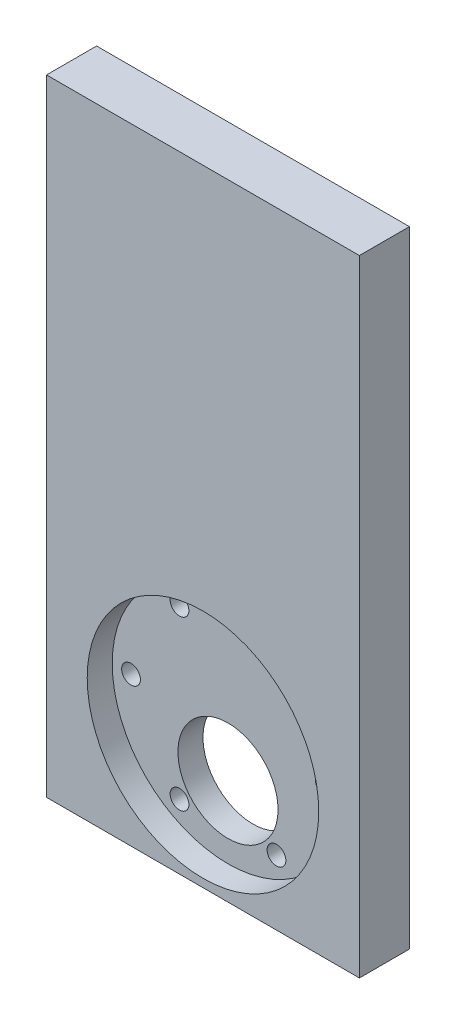
ISO-10303-21;
HEADER;
FILE_DESCRIPTION(('STEP AP214'),'2;1');
FILE_NAME('part.step','',(''),(''),'','','');
FILE_SCHEMA(('AUTOMOTIVE_DESIGN { 1 0 10303 214 1 1 1 1 }'));
ENDSEC;
DATA;
#1=APPLICATION_CONTEXT('core data for automotive mechanical design processes');
#2=APPLICATION_PROTOCOL_DEFINITION('international standard','automotive_design',2000,#1);
#3=PRODUCT_CONTEXT('',#1,'mechanical');
#4=PRODUCT('Part','Part','',(#3));
#5=PRODUCT_RELATED_PRODUCT_CATEGORY('part','',(#4));
#6=PRODUCT_DEFINITION_FORMATION('','',#4);
#7=PRODUCT_DEFINITION_CONTEXT('part definition',#1,'design');
#8=PRODUCT_DEFINITION('design','',#6,#7);
#9=PRODUCT_DEFINITION_SHAPE('','',#8);
#10=(LENGTH_UNIT() NAMED_UNIT(*) SI_UNIT(.MILLI.,.METRE.));
#11=(NAMED_UNIT(*) PLANE_ANGLE_UNIT() SI_UNIT($,.RADIAN.));
#12=(NAMED_UNIT(*) SI_UNIT($,.STERADIAN.) SOLID_ANGLE_UNIT());
#13=UNCERTAINTY_MEASURE_WITH_UNIT(LENGTH_MEASURE(1.E-05),#10,'distance_accuracy_value','');
#14=(GEOMETRIC_REPRESENTATION_CONTEXT(3) GLOBAL_UNCERTAINTY_ASSIGNED_CONTEXT((#13)) GLOBAL_UNIT_ASSIGNED_CONTEXT((#10,
#11,#12)) REPRESENTATION_CONTEXT('',''));
#15=CARTESIAN_POINT('',(0.,0.,0.));
#16=DIRECTION('',(0.,0.,1.));
#17=DIRECTION('',(1.,0.,0.));
#18=AXIS2_PLACEMENT_3D('',#15,#16,#17);
#19=CARTESIAN_POINT('',(7.75,33.2233937586588,10.));
#20=DIRECTION('',(0.,0.,-1.));
#21=DIRECTION('',(-1.,0.,0.));
#22=AXIS2_PLACEMENT_3D('',#19,#20,#21);
#23=CYLINDRICAL_SURFACE('',#22,1.5);
#24=CARTESIAN_POINT('',(7.75,33.2233937586588,0.));
#25=DIRECTION('',(0.,0.,1.));
#26=DIRECTION('',(1.,0.,0.));
#27=AXIS2_PLACEMENT_3D('',#24,#25,#26);
#28=CIRCLE('',#27,1.5);
#29=CARTESIAN_POINT('',(9.25,33.2233937586588,0.));
#30=VERTEX_POINT('',#29);
#31=EDGE_CURVE('E122',#30,#30,#28,.T.);
#32=ORIENTED_EDGE('',*,*,#31,.F.);
#33=EDGE_LOOP('',(#32));
#34=FACE_BOUND('',#33,.T.);
#35=CARTESIAN_POINT('',(7.75,33.2233937586588,4.));
#36=DIRECTION('',(0.,0.,1.));
#37=DIRECTION('',(1.,0.,0.));
#38=AXIS2_PLACEMENT_3D('',#35,#36,#37);
#39=CIRCLE('',#38,1.5);
#40=CARTESIAN_POINT('',(9.25,33.2233937586588,4.));
#41=VERTEX_POINT('',#40);
#42=EDGE_CURVE('E185',#41,#41,#39,.T.);
#43=ORIENTED_EDGE('',*,*,#42,.T.);
#44=EDGE_LOOP('',(#43));
#45=FACE_BOUND('',#44,.T.);
#46=ADVANCED_FACE('F49',(#34,#45),#23,.F.);
#47=CARTESIAN_POINT('',(0.,12.8,10.));
#48=DIRECTION('',(0.,0.,-1.));
#49=DIRECTION('',(-1.,0.,0.));
#50=AXIS2_PLACEMENT_3D('',#47,#48,#49);
#51=CYLINDRICAL_SURFACE('',#50,8.00000000000001);
#52=CARTESIAN_POINT('',(0.,12.8,0.));
#53=DIRECTION('',(0.,0.,1.));
#54=DIRECTION('',(1.,0.,0.));
#55=AXIS2_PLACEMENT_3D('',#52,#53,#54);
#56=CIRCLE('',#55,8.00000000000001);
#57=CARTESIAN_POINT('',(8.00000000000001,12.8,0.));
#58=VERTEX_POINT('',#57);
#59=EDGE_CURVE('E223',#58,#58,#56,.T.);
#60=ORIENTED_EDGE('',*,*,#59,.F.);
#61=EDGE_LOOP('',(#60));
#62=FACE_BOUND('',#61,.T.);
#63=CARTESIAN_POINT('',(0.,12.8,4.));
#64=DIRECTION('',(0.,0.,1.));
#65=DIRECTION('',(1.,0.,0.));
#66=AXIS2_PLACEMENT_3D('',#63,#64,#65);
#67=CIRCLE('',#66,8.00000000000001);
#68=CARTESIAN_POINT('',(8.00000000000001,12.8,4.));
#69=VERTEX_POINT('',#68);
#70=EDGE_CURVE('E189',#69,#69,#67,.T.);
#71=ORIENTED_EDGE('',*,*,#70,.T.);
#72=EDGE_LOOP('',(#71));
#73=FACE_BOUND('',#72,.T.);
#74=ADVANCED_FACE('F147',(#62,#73),#51,.F.);
#75=CARTESIAN_POINT('',(15.5,19.8,10.));
#76=DIRECTION('',(0.,0.,-1.));
#77=DIRECTION('',(-1.,0.,0.));
#78=AXIS2_PLACEMENT_3D('',#75,#76,#77);
#79=CYLINDRICAL_SURFACE('',#78,1.5);
#80=CARTESIAN_POINT('',(15.5,19.8,0.));
#81=DIRECTION('',(0.,0.,1.));
#82=DIRECTION('',(1.,0.,0.));
#83=AXIS2_PLACEMENT_3D('',#80,#81,#82);
#84=CIRCLE('',#83,1.5);
#85=CARTESIAN_POINT('',(17.,19.8,0.));
#86=VERTEX_POINT('',#85);
#87=EDGE_CURVE('E224',#86,#86,#84,.T.);
#88=ORIENTED_EDGE('',*,*,#87,.F.);
#89=EDGE_LOOP('',(#88));
#90=FACE_BOUND('',#89,.T.);
#91=CARTESIAN_POINT('',(15.5,19.8,4.));
#92=DIRECTION('',(0.,0.,1.));
#93=DIRECTION('',(1.,0.,0.));
#94=AXIS2_PLACEMENT_3D('',#91,#92,#93);
#95=CIRCLE('',#94,1.5);
#96=CARTESIAN_POINT('',(17.,19.8,4.));
#97=VERTEX_POINT('',#96);
#98=EDGE_CURVE('E193',#97,#97,#95,.T.);
#99=ORIENTED_EDGE('',*,*,#98,.T.);
#100=EDGE_LOOP('',(#99));
#101=FACE_BOUND('',#100,.T.);
#102=ADVANCED_FACE('F153',(#90,#101),#79,.F.);
#103=CARTESIAN_POINT('',(7.75,6.3766062413412,10.));
#104=DIRECTION('',(0.,0.,-1.));
#105=DIRECTION('',(-1.,0.,0.));
#106=AXIS2_PLACEMENT_3D('',#103,#104,#105);
#107=CYLINDRICAL_SURFACE('',#106,1.5);
#108=CARTESIAN_POINT('',(7.75,6.3766062413412,0.));
#109=DIRECTION('',(0.,0.,1.));
#110=DIRECTION('',(1.,0.,0.));
#111=AXIS2_PLACEMENT_3D('',#108,#109,#110);
#112=CIRCLE('',#111,1.5);
#113=CARTESIAN_POINT('',(9.25,6.3766062413412,0.));
#114=VERTEX_POINT('',#113);
#115=EDGE_CURVE('E227',#114,#114,#112,.T.);
#116=ORIENTED_EDGE('',*,*,#115,.F.);
#117=EDGE_LOOP('',(#116));
#118=FACE_BOUND('',#117,.T.);
#119=CARTESIAN_POINT('',(7.75,6.3766062413412,4.));
#120=DIRECTION('',(0.,0.,1.));
#121=DIRECTION('',(1.,0.,0.));
#122=AXIS2_PLACEMENT_3D('',#119,#120,#121);
#123=CIRCLE('',#122,1.5);
#124=CARTESIAN_POINT('',(9.25,6.3766062413412,4.));
#125=VERTEX_POINT('',#124);
#126=EDGE_CURVE('E197',#125,#125,#123,.T.);
#127=ORIENTED_EDGE('',*,*,#126,.T.);
#128=EDGE_LOOP('',(#127));
#129=FACE_BOUND('',#128,.T.);
#130=ADVANCED_FACE('F159',(#118,#129),#107,.F.);
#131=CARTESIAN_POINT('',(-7.75,6.37660624134121,10.));
#132=DIRECTION('',(0.,0.,-1.));
#133=DIRECTION('',(-1.,0.,0.));
#134=AXIS2_PLACEMENT_3D('',#131,#132,#133);
#135=CYLINDRICAL_SURFACE('',#134,1.5);
#136=CARTESIAN_POINT('',(-7.75,6.37660624134121,0.));
#137=DIRECTION('',(0.,0.,1.));
#138=DIRECTION('',(1.,0.,0.));
#139=AXIS2_PLACEMENT_3D('',#136,#137,#138);
#140=CIRCLE('',#139,1.5);
#141=CARTESIAN_POINT('',(-6.25,6.37660624134121,0.));
#142=VERTEX_POINT('',#141);
#143=EDGE_CURVE('E235',#142,#142,#140,.T.);
#144=ORIENTED_EDGE('',*,*,#143,.F.);
#145=EDGE_LOOP('',(#144));
#146=FACE_BOUND('',#145,.T.);
#147=CARTESIAN_POINT('',(-7.75,6.37660624134121,4.));
#148=DIRECTION('',(0.,0.,1.));
#149=DIRECTION('',(1.,0.,0.));
#150=AXIS2_PLACEMENT_3D('',#147,#148,#149);
#151=CIRCLE('',#150,1.5);
#152=CARTESIAN_POINT('',(-6.25,6.37660624134121,4.));
#153=VERTEX_POINT('',#152);
#154=EDGE_CURVE('E201',#153,#153,#151,.T.);
#155=ORIENTED_EDGE('',*,*,#154,.T.);
#156=EDGE_LOOP('',(#155));
#157=FACE_BOUND('',#156,.T.);
#158=ADVANCED_FACE('F162',(#146,#157),#135,.F.);
#159=CARTESIAN_POINT('',(-15.5,19.8,10.));
#160=DIRECTION('',(0.,0.,-1.));
#161=DIRECTION('',(-1.,0.,0.));
#162=AXIS2_PLACEMENT_3D('',#159,#160,#161);
#163=CYLINDRICAL_SURFACE('',#162,1.5);
#164=CARTESIAN_POINT('',(-15.5,19.8,0.));
#165=DIRECTION('',(0.,0.,1.));
#166=DIRECTION('',(1.,0.,0.));
#167=AXIS2_PLACEMENT_3D('',#164,#165,#166);
#168=CIRCLE('',#167,1.5);
#169=CARTESIAN_POINT('',(-14.,19.8,0.));
#170=VERTEX_POINT('',#169);
#171=EDGE_CURVE('E232',#170,#170,#168,.T.);
#172=ORIENTED_EDGE('',*,*,#171,.F.);
#173=EDGE_LOOP('',(#172));
#174=FACE_BOUND('',#173,.T.);
#175=CARTESIAN_POINT('',(-15.5,19.8,4.));
#176=DIRECTION('',(0.,0.,1.));
#177=DIRECTION('',(1.,0.,0.));
#178=AXIS2_PLACEMENT_3D('',#175,#176,#177);
#179=CIRCLE('',#178,1.5);
#180=CARTESIAN_POINT('',(-14.,19.8,4.));
#181=VERTEX_POINT('',#180);
#182=EDGE_CURVE('E205',#181,#181,#179,.T.);
#183=ORIENTED_EDGE('',*,*,#182,.T.);
#184=EDGE_LOOP('',(#183));
#185=FACE_BOUND('',#184,.T.);
#186=ADVANCED_FACE('F166',(#174,#185),#163,.F.);
#187=CARTESIAN_POINT('',(-7.75,33.2233937586588,10.));
#188=DIRECTION('',(0.,0.,-1.));
#189=DIRECTION('',(-1.,0.,0.));
#190=AXIS2_PLACEMENT_3D('',#187,#188,#189);
#191=CYLINDRICAL_SURFACE('',#190,1.5);
#192=CARTESIAN_POINT('',(-7.75,33.2233937586588,0.));
#193=DIRECTION('',(0.,0.,1.));
#194=DIRECTION('',(1.,0.,0.));
#195=AXIS2_PLACEMENT_3D('',#192,#193,#194);
#196=CIRCLE('',#195,1.5);
#197=CARTESIAN_POINT('',(-6.25,33.2233937586588,0.));
#198=VERTEX_POINT('',#197);
#199=EDGE_CURVE('E230',#198,#198,#196,.T.);
#200=ORIENTED_EDGE('',*,*,#199,.F.);
#201=EDGE_LOOP('',(#200));
#202=FACE_BOUND('',#201,.T.);
#203=CARTESIAN_POINT('',(-7.75,33.2233937586588,4.));
#204=DIRECTION('',(0.,0.,1.));
#205=DIRECTION('',(1.,0.,0.));
#206=AXIS2_PLACEMENT_3D('',#203,#204,#205);
#207=CIRCLE('',#206,1.5);
#208=CARTESIAN_POINT('',(-6.25,33.2233937586588,4.));
#209=VERTEX_POINT('',#208);
#210=EDGE_CURVE('E53',#209,#209,#207,.T.);
#211=ORIENTED_EDGE('',*,*,#210,.T.);
#212=EDGE_LOOP('',(#211));
#213=FACE_BOUND('',#212,.T.);
#214=ADVANCED_FACE('F170',(#202,#213),#191,.F.);
#215=CARTESIAN_POINT('',(-25.,100.,8.));
#216=DIRECTION('',(0.,1.,0.));
#217=DIRECTION('',(-1.,0.,0.));
#218=AXIS2_PLACEMENT_3D('',#215,#216,#217);
#219=PLANE('',#218);
#220=DIRECTION('',(1.,0.,0.));
#221=VECTOR('',#220,1.);
#222=CARTESIAN_POINT('',(-25.,100.,0.));
#223=LINE('',#222,#221);
#224=CARTESIAN_POINT('',(-25.,100.,0.));
#225=VERTEX_POINT('',#224);
#226=CARTESIAN_POINT('',(25.,100.,0.));
#227=VERTEX_POINT('',#226);
#228=EDGE_CURVE('E118',#225,#227,#223,.T.);
#229=ORIENTED_EDGE('',*,*,#228,.F.);
#230=DIRECTION('',(0.,0.,-1.));
#231=VECTOR('',#230,1.);
#232=CARTESIAN_POINT('',(-25.,100.,8.));
#233=LINE('',#232,#231);
#234=CARTESIAN_POINT('',(-25.,100.,8.));
#235=VERTEX_POINT('',#234);
#236=EDGE_CURVE('E12',#235,#225,#233,.T.);
#237=ORIENTED_EDGE('',*,*,#236,.F.);
#238=DIRECTION('',(1.,0.,0.));
#239=VECTOR('',#238,1.);
#240=CARTESIAN_POINT('',(-25.,100.,8.));
#241=LINE('',#240,#239);
#242=CARTESIAN_POINT('',(25.,100.,8.));
#243=VERTEX_POINT('',#242);
#244=EDGE_CURVE('E112',#235,#243,#241,.T.);
#245=ORIENTED_EDGE('',*,*,#244,.T.);
#246=DIRECTION('',(0.,0.,-1.));
#247=VECTOR('',#246,1.);
#248=CARTESIAN_POINT('',(25.,100.,8.));
#249=LINE('',#248,#247);
#250=EDGE_CURVE('E91',#243,#227,#249,.T.);
#251=ORIENTED_EDGE('',*,*,#250,.T.);
#252=EDGE_LOOP('',(#229,#237,#245,#251));
#253=FACE_BOUND('',#252,.T.);
#254=ADVANCED_FACE('F51',(#253),#219,.T.);
#255=CARTESIAN_POINT('',(-25.,100.,8.));
#256=DIRECTION('',(1.,0.,0.));
#257=DIRECTION('',(0.,1.,0.));
#258=AXIS2_PLACEMENT_3D('',#255,#256,#257);
#259=PLANE('',#258);
#260=DIRECTION('',(0.,-1.,0.));
#261=VECTOR('',#260,1.);
#262=CARTESIAN_POINT('',(-25.,100.,0.));
#263=LINE('',#262,#261);
#264=CARTESIAN_POINT('',(-25.,0.,0.));
#265=VERTEX_POINT('',#264);
#266=EDGE_CURVE('E83',#225,#265,#263,.T.);
#267=ORIENTED_EDGE('',*,*,#266,.T.);
#268=DIRECTION('',(0.,0.,-1.));
#269=VECTOR('',#268,1.);
#270=CARTESIAN_POINT('',(-25.,0.,8.));
#271=LINE('',#270,#269);
#272=CARTESIAN_POINT('',(-25.,0.,8.));
#273=VERTEX_POINT('',#272);
#274=EDGE_CURVE('E59',#273,#265,#271,.T.);
#275=ORIENTED_EDGE('',*,*,#274,.F.);
#276=DIRECTION('',(0.,-1.,0.));
#277=VECTOR('',#276,1.);
#278=CARTESIAN_POINT('',(-25.,100.,8.));
#279=LINE('',#278,#277);
#280=EDGE_CURVE('E101',#235,#273,#279,.T.);
#281=ORIENTED_EDGE('',*,*,#280,.F.);
#282=ORIENTED_EDGE('',*,*,#236,.T.);
#283=EDGE_LOOP('',(#267,#275,#281,#282));
#284=FACE_BOUND('',#283,.T.);
#285=ADVANCED_FACE('F333',(#284),#259,.F.);
#286=CARTESIAN_POINT('',(-25.,0.,8.));
#287=DIRECTION('',(0.,1.,0.));
#288=DIRECTION('',(-1.,0.,0.));
#289=AXIS2_PLACEMENT_3D('',#286,#287,#288);
#290=PLANE('',#289);
#291=DIRECTION('',(1.,0.,0.));
#292=VECTOR('',#291,1.);
#293=CARTESIAN_POINT('',(-25.,0.,0.));
#294=LINE('',#293,#292);
#295=CARTESIAN_POINT('',(25.,0.,0.));
#296=VERTEX_POINT('',#295);
#297=EDGE_CURVE('E108',#265,#296,#294,.T.);
#298=ORIENTED_EDGE('',*,*,#297,.T.);
#299=DIRECTION('',(0.,0.,-1.));
#300=VECTOR('',#299,1.);
#301=CARTESIAN_POINT('',(25.,0.,8.));
#302=LINE('',#301,#300);
#303=CARTESIAN_POINT('',(25.,0.,8.));
#304=VERTEX_POINT('',#303);
#305=EDGE_CURVE('E105',#304,#296,#302,.T.);
#306=ORIENTED_EDGE('',*,*,#305,.F.);
#307=DIRECTION('',(1.,0.,0.));
#308=VECTOR('',#307,1.);
#309=CARTESIAN_POINT('',(-25.,0.,8.));
#310=LINE('',#309,#308);
#311=EDGE_CURVE('E96',#273,#304,#310,.T.);
#312=ORIENTED_EDGE('',*,*,#311,.F.);
#313=ORIENTED_EDGE('',*,*,#274,.T.);
#314=EDGE_LOOP('',(#298,#306,#312,#313));
#315=FACE_BOUND('',#314,.T.);
#316=ADVANCED_FACE('F106',(#315),#290,.F.);
#317=CARTESIAN_POINT('',(25.,100.,8.));
#318=DIRECTION('',(1.,0.,0.));
#319=DIRECTION('',(0.,1.,0.));
#320=AXIS2_PLACEMENT_3D('',#317,#318,#319);
#321=PLANE('',#320);
#322=DIRECTION('',(0.,-1.,0.));
#323=VECTOR('',#322,1.);
#324=CARTESIAN_POINT('',(25.,100.,0.));
#325=LINE('',#324,#323);
#326=EDGE_CURVE('E121',#227,#296,#325,.T.);
#327=ORIENTED_EDGE('',*,*,#326,.F.);
#328=ORIENTED_EDGE('',*,*,#250,.F.);
#329=DIRECTION('',(0.,-1.,0.));
#330=VECTOR('',#329,1.);
#331=CARTESIAN_POINT('',(25.,100.,8.));
#332=LINE('',#331,#330);
#333=EDGE_CURVE('E100',#243,#304,#332,.T.);
#334=ORIENTED_EDGE('',*,*,#333,.T.);
#335=ORIENTED_EDGE('',*,*,#305,.T.);
#336=EDGE_LOOP('',(#327,#328,#334,#335));
#337=FACE_BOUND('',#336,.T.);
#338=ADVANCED_FACE('F111',(#337),#321,.T.);
#339=CARTESIAN_POINT('',(0.,0.,8.));
#340=DIRECTION('',(0.,0.,-1.));
#341=DIRECTION('',(-1.,0.,0.));
#342=AXIS2_PLACEMENT_3D('',#339,#340,#341);
#343=PLANE('',#342);
#344=CARTESIAN_POINT('',(0.,19.8,8.));
#345=DIRECTION('',(0.,0.,1.));
#346=DIRECTION('',(1.,0.,0.));
#347=AXIS2_PLACEMENT_3D('',#344,#345,#346);
#348=CIRCLE('',#347,18.5);
#349=CARTESIAN_POINT('',(18.5,19.8,8.));
#350=VERTEX_POINT('',#349);
#351=EDGE_CURVE('E212',#350,#350,#348,.T.);
#352=ORIENTED_EDGE('',*,*,#351,.F.);
#353=EDGE_LOOP('',(#352));
#354=FACE_BOUND('',#353,.T.);
#355=ORIENTED_EDGE('',*,*,#244,.F.);
#356=ORIENTED_EDGE('',*,*,#280,.T.);
#357=ORIENTED_EDGE('',*,*,#311,.T.);
#358=ORIENTED_EDGE('',*,*,#333,.F.);
#359=EDGE_LOOP('',(#355,#356,#357,#358));
#360=FACE_BOUND('',#359,.T.);
#361=ADVANCED_FACE('F99',(#354,#360),#343,.F.);
#362=CARTESIAN_POINT('',(0.,0.,0.));
#363=DIRECTION('',(0.,0.,-1.));
#364=DIRECTION('',(-1.,0.,0.));
#365=AXIS2_PLACEMENT_3D('',#362,#363,#364);
#366=PLANE('',#365);
#367=ORIENTED_EDGE('',*,*,#199,.T.);
#368=EDGE_LOOP('',(#367));
#369=FACE_BOUND('',#368,.T.);
#370=ORIENTED_EDGE('',*,*,#171,.T.);
#371=EDGE_LOOP('',(#370));
#372=FACE_BOUND('',#371,.T.);
#373=ORIENTED_EDGE('',*,*,#143,.T.);
#374=EDGE_LOOP('',(#373));
#375=FACE_BOUND('',#374,.T.);
#376=ORIENTED_EDGE('',*,*,#115,.T.);
#377=EDGE_LOOP('',(#376));
#378=FACE_BOUND('',#377,.T.);
#379=ORIENTED_EDGE('',*,*,#87,.T.);
#380=EDGE_LOOP('',(#379));
#381=FACE_BOUND('',#380,.T.);
#382=ORIENTED_EDGE('',*,*,#59,.T.);
#383=EDGE_LOOP('',(#382));
#384=FACE_BOUND('',#383,.T.);
#385=ORIENTED_EDGE('',*,*,#31,.T.);
#386=EDGE_LOOP('',(#385));
#387=FACE_BOUND('',#386,.T.);
#388=ORIENTED_EDGE('',*,*,#228,.T.);
#389=ORIENTED_EDGE('',*,*,#326,.T.);
#390=ORIENTED_EDGE('',*,*,#297,.F.);
#391=ORIENTED_EDGE('',*,*,#266,.F.);
#392=EDGE_LOOP('',(#388,#389,#390,#391));
#393=FACE_BOUND('',#392,.T.);
#394=ADVANCED_FACE('F127',(#369,#372,#375,#378,#381,#384,#387,#393),#366,.T.);
#395=CARTESIAN_POINT('',(0.,19.8,4.));
#396=DIRECTION('',(0.,0.,1.));
#397=DIRECTION('',(1.,0.,0.));
#398=AXIS2_PLACEMENT_3D('',#395,#396,#397);
#399=CYLINDRICAL_SURFACE('',#398,18.5);
#400=CARTESIAN_POINT('',(0.,19.8,4.));
#401=DIRECTION('',(0.,0.,1.));
#402=DIRECTION('',(1.,0.,0.));
#403=AXIS2_PLACEMENT_3D('',#400,#401,#402);
#404=CIRCLE('',#403,18.5);
#405=CARTESIAN_POINT('',(18.5,19.8,4.));
#406=VERTEX_POINT('',#405);
#407=EDGE_CURVE('E211',#406,#406,#404,.T.);
#408=ORIENTED_EDGE('',*,*,#407,.F.);
#409=EDGE_LOOP('',(#408));
#410=FACE_BOUND('',#409,.T.);
#411=ORIENTED_EDGE('',*,*,#351,.T.);
#412=EDGE_LOOP('',(#411));
#413=FACE_BOUND('',#412,.T.);
#414=ADVANCED_FACE('F129',(#410,#413),#399,.F.);
#415=CARTESIAN_POINT('',(0.,19.8,4.));
#416=DIRECTION('',(0.,0.,1.));
#417=DIRECTION('',(1.,0.,0.));
#418=AXIS2_PLACEMENT_3D('',#415,#416,#417);
#419=PLANE('',#418);
#420=ORIENTED_EDGE('',*,*,#42,.F.);
#421=EDGE_LOOP('',(#420));
#422=FACE_BOUND('',#421,.T.);
#423=ORIENTED_EDGE('',*,*,#70,.F.);
#424=EDGE_LOOP('',(#423));
#425=FACE_BOUND('',#424,.T.);
#426=ORIENTED_EDGE('',*,*,#98,.F.);
#427=EDGE_LOOP('',(#426));
#428=FACE_BOUND('',#427,.T.);
#429=ORIENTED_EDGE('',*,*,#126,.F.);
#430=EDGE_LOOP('',(#429));
#431=FACE_BOUND('',#430,.T.);
#432=ORIENTED_EDGE('',*,*,#154,.F.);
#433=EDGE_LOOP('',(#432));
#434=FACE_BOUND('',#433,.T.);
#435=ORIENTED_EDGE('',*,*,#182,.F.);
#436=EDGE_LOOP('',(#435));
#437=FACE_BOUND('',#436,.T.);
#438=ORIENTED_EDGE('',*,*,#210,.F.);
#439=EDGE_LOOP('',(#438));
#440=FACE_BOUND('',#439,.T.);
#441=ORIENTED_EDGE('',*,*,#407,.T.);
#442=EDGE_LOOP('',(#441));
#443=FACE_BOUND('',#442,.T.);
#444=ADVANCED_FACE('F137',(#422,#425,#428,#431,#434,#437,#440,#443),#419,.T.);
#445=CLOSED_SHELL('',(#46,#74,#102,#130,#158,#186,#214,#254,#285,#316,#338,#361,#394,#414,#444));
#446=MANIFOLD_SOLID_BREP('B2',#445);
#447=ADVANCED_BREP_SHAPE_REPRESENTATION('',(#18,#446),#14);
#448=SHAPE_DEFINITION_REPRESENTATION(#9,#447);
ENDSEC;
END-ISO-10303-21;
